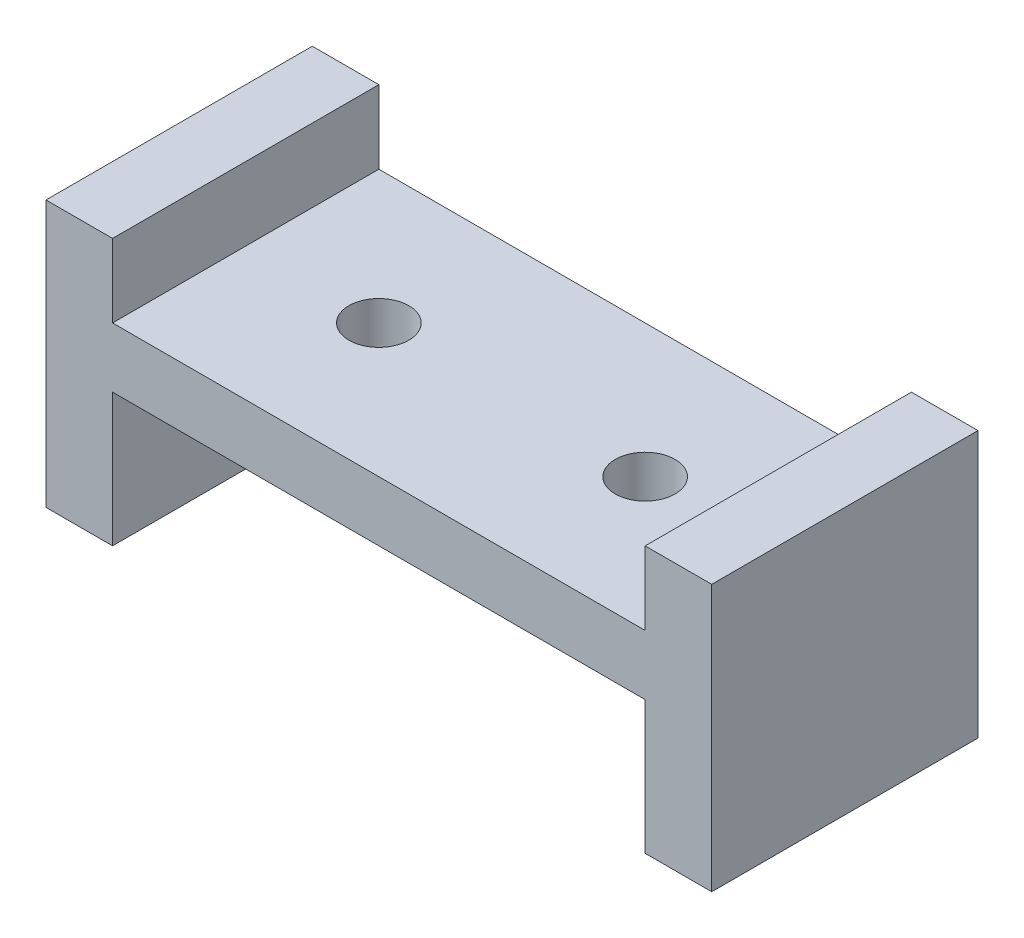
ISO-10303-21;
HEADER;
FILE_DESCRIPTION(('STEP AP214'),'2;1');
FILE_NAME('part.step','',(''),(''),'','','');
FILE_SCHEMA(('AUTOMOTIVE_DESIGN { 1 0 10303 214 1 1 1 1 }'));
ENDSEC;
DATA;
#1=APPLICATION_CONTEXT('core data for automotive mechanical design processes');
#2=APPLICATION_PROTOCOL_DEFINITION('international standard','automotive_design',2000,#1);
#3=PRODUCT_CONTEXT('',#1,'mechanical');
#4=PRODUCT('Part','Part','',(#3));
#5=PRODUCT_RELATED_PRODUCT_CATEGORY('part','',(#4));
#6=PRODUCT_DEFINITION_FORMATION('','',#4);
#7=PRODUCT_DEFINITION_CONTEXT('part definition',#1,'design');
#8=PRODUCT_DEFINITION('design','',#6,#7);
#9=PRODUCT_DEFINITION_SHAPE('','',#8);
#10=(LENGTH_UNIT() NAMED_UNIT(*) SI_UNIT(.MILLI.,.METRE.));
#11=(NAMED_UNIT(*) PLANE_ANGLE_UNIT() SI_UNIT($,.RADIAN.));
#12=(NAMED_UNIT(*) SI_UNIT($,.STERADIAN.) SOLID_ANGLE_UNIT());
#13=UNCERTAINTY_MEASURE_WITH_UNIT(LENGTH_MEASURE(1.E-05),#10,'distance_accuracy_value','');
#14=(GEOMETRIC_REPRESENTATION_CONTEXT(3) GLOBAL_UNCERTAINTY_ASSIGNED_CONTEXT((#13)) GLOBAL_UNIT_ASSIGNED_CONTEXT((#10,
#11,#12)) REPRESENTATION_CONTEXT('',''));
#15=CARTESIAN_POINT('',(0.,0.,0.));
#16=DIRECTION('',(0.,0.,1.));
#17=DIRECTION('',(1.,0.,0.));
#18=AXIS2_PLACEMENT_3D('',#15,#16,#17);
#19=CARTESIAN_POINT('',(0.,4.5,0.));
#20=DIRECTION('',(0.,1.,0.));
#21=DIRECTION('',(0.,0.,1.));
#22=AXIS2_PLACEMENT_3D('',#19,#20,#21);
#23=PLANE('',#22);
#24=CARTESIAN_POINT('',(-30.,4.5,185.));
#25=DIRECTION('',(0.,1.,0.));
#26=DIRECTION('',(0.,0.,1.));
#27=AXIS2_PLACEMENT_3D('',#24,#25,#26);
#28=CIRCLE('',#27,2.25);
#29=CARTESIAN_POINT('',(-30.,4.5,187.25));
#30=VERTEX_POINT('',#29);
#31=EDGE_CURVE('E213',#30,#30,#28,.T.);
#32=ORIENTED_EDGE('',*,*,#31,.F.);
#33=EDGE_LOOP('',(#32));
#34=FACE_BOUND('',#33,.T.);
#35=CARTESIAN_POINT('',(-9.99999999999998,4.5,185.));
#36=DIRECTION('',(0.,1.,0.));
#37=DIRECTION('',(0.,0.,1.));
#38=AXIS2_PLACEMENT_3D('',#35,#36,#37);
#39=CIRCLE('',#38,2.25);
#40=CARTESIAN_POINT('',(-9.99999999999998,4.5,187.25));
#41=VERTEX_POINT('',#40);
#42=EDGE_CURVE('E207',#41,#41,#39,.T.);
#43=ORIENTED_EDGE('',*,*,#42,.F.);
#44=EDGE_LOOP('',(#43));
#45=FACE_BOUND('',#44,.T.);
#46=DIRECTION('',(-1.,0.,0.));
#47=VECTOR('',#46,1.);
#48=CARTESIAN_POINT('',(5.00000000000004,4.5,175.));
#49=LINE('',#48,#47);
#50=CARTESIAN_POINT('',(0.,4.5,175.));
#51=VERTEX_POINT('',#50);
#52=CARTESIAN_POINT('',(-40.,4.5,175.));
#53=VERTEX_POINT('',#52);
#54=EDGE_CURVE('E220',#51,#53,#49,.T.);
#55=ORIENTED_EDGE('',*,*,#54,.T.);
#56=DIRECTION('',(0.,0.,-1.));
#57=VECTOR('',#56,1.);
#58=CARTESIAN_POINT('',(-40.,4.5,175.));
#59=LINE('',#58,#57);
#60=CARTESIAN_POINT('',(-40.,4.5,195.));
#61=VERTEX_POINT('',#60);
#62=EDGE_CURVE('E57',#61,#53,#59,.T.);
#63=ORIENTED_EDGE('',*,*,#62,.F.);
#64=DIRECTION('',(1.,0.,0.));
#65=VECTOR('',#64,1.);
#66=CARTESIAN_POINT('',(-45.,4.5,195.));
#67=LINE('',#66,#65);
#68=CARTESIAN_POINT('',(0.,4.5,195.));
#69=VERTEX_POINT('',#68);
#70=EDGE_CURVE('E218',#61,#69,#67,.T.);
#71=ORIENTED_EDGE('',*,*,#70,.T.);
#72=DIRECTION('',(0.,0.,1.));
#73=VECTOR('',#72,1.);
#74=CARTESIAN_POINT('',(0.,4.5,175.));
#75=LINE('',#74,#73);
#76=EDGE_CURVE('E187',#51,#69,#75,.T.);
#77=ORIENTED_EDGE('',*,*,#76,.F.);
#78=EDGE_LOOP('',(#55,#63,#71,#77));
#79=FACE_BOUND('',#78,.T.);
#80=ADVANCED_FACE('F34',(#34,#45,#79),#23,.T.);
#81=CARTESIAN_POINT('',(0.,0.,0.));
#82=DIRECTION('',(0.,1.,0.));
#83=DIRECTION('',(0.,0.,1.));
#84=AXIS2_PLACEMENT_3D('',#81,#82,#83);
#85=PLANE('',#84);
#86=DIRECTION('',(1.,0.,0.));
#87=VECTOR('',#86,1.);
#88=CARTESIAN_POINT('',(-4.99999999999996,0.,195.));
#89=LINE('',#88,#87);
#90=CARTESIAN_POINT('',(-40.,0.,195.));
#91=VERTEX_POINT('',#90);
#92=CARTESIAN_POINT('',(0.,0.,195.));
#93=VERTEX_POINT('',#92);
#94=EDGE_CURVE('E49',#91,#93,#89,.T.);
#95=ORIENTED_EDGE('',*,*,#94,.F.);
#96=DIRECTION('',(0.,0.,-1.));
#97=VECTOR('',#96,1.);
#98=CARTESIAN_POINT('',(-40.,0.,0.));
#99=LINE('',#98,#97);
#100=CARTESIAN_POINT('',(-40.,0.,175.));
#101=VERTEX_POINT('',#100);
#102=EDGE_CURVE('E129',#91,#101,#99,.T.);
#103=ORIENTED_EDGE('',*,*,#102,.T.);
#104=DIRECTION('',(-1.,0.,0.));
#105=VECTOR('',#104,1.);
#106=CARTESIAN_POINT('',(-35.,0.,175.));
#107=LINE('',#106,#105);
#108=CARTESIAN_POINT('',(0.,0.,175.));
#109=VERTEX_POINT('',#108);
#110=EDGE_CURVE('E221',#109,#101,#107,.T.);
#111=ORIENTED_EDGE('',*,*,#110,.F.);
#112=DIRECTION('',(0.,0.,1.));
#113=VECTOR('',#112,1.);
#114=CARTESIAN_POINT('',(0.,0.,0.));
#115=LINE('',#114,#113);
#116=EDGE_CURVE('E130',#109,#93,#115,.T.);
#117=ORIENTED_EDGE('',*,*,#116,.T.);
#118=EDGE_LOOP('',(#95,#103,#111,#117));
#119=FACE_BOUND('',#118,.T.);
#120=CARTESIAN_POINT('',(-30.,0.,185.));
#121=DIRECTION('',(0.,1.,0.));
#122=DIRECTION('',(0.,0.,1.));
#123=AXIS2_PLACEMENT_3D('',#120,#121,#122);
#124=CIRCLE('',#123,2.25);
#125=CARTESIAN_POINT('',(-30.,0.,187.25));
#126=VERTEX_POINT('',#125);
#127=EDGE_CURVE('E210',#126,#126,#124,.T.);
#128=ORIENTED_EDGE('',*,*,#127,.T.);
#129=EDGE_LOOP('',(#128));
#130=FACE_BOUND('',#129,.T.);
#131=CARTESIAN_POINT('',(-9.99999999999998,0.,185.));
#132=DIRECTION('',(0.,1.,0.));
#133=DIRECTION('',(0.,0.,1.));
#134=AXIS2_PLACEMENT_3D('',#131,#132,#133);
#135=CIRCLE('',#134,2.25);
#136=CARTESIAN_POINT('',(-9.99999999999998,0.,187.25));
#137=VERTEX_POINT('',#136);
#138=EDGE_CURVE('E206',#137,#137,#135,.T.);
#139=ORIENTED_EDGE('',*,*,#138,.T.);
#140=EDGE_LOOP('',(#139));
#141=FACE_BOUND('',#140,.T.);
#142=ADVANCED_FACE('F264',(#119,#130,#141),#85,.F.);
#143=CARTESIAN_POINT('',(-45.,4.5,175.));
#144=DIRECTION('',(1.,0.,0.));
#145=DIRECTION('',(0.,0.,-1.));
#146=AXIS2_PLACEMENT_3D('',#143,#144,#145);
#147=PLANE('',#146);
#148=DIRECTION('',(0.,-1.,0.));
#149=VECTOR('',#148,1.);
#150=CARTESIAN_POINT('',(-45.,4.5,175.));
#151=LINE('',#150,#149);
#152=CARTESIAN_POINT('',(-45.,10.,175.));
#153=VERTEX_POINT('',#152);
#154=CARTESIAN_POINT('',(-45.,-10.,175.));
#155=VERTEX_POINT('',#154);
#156=EDGE_CURVE('E223',#153,#155,#151,.T.);
#157=ORIENTED_EDGE('',*,*,#156,.T.);
#158=DIRECTION('',(0.,0.,-1.));
#159=VECTOR('',#158,1.);
#160=CARTESIAN_POINT('',(-45.,-10.,0.));
#161=LINE('',#160,#159);
#162=CARTESIAN_POINT('',(-45.,-10.,195.));
#163=VERTEX_POINT('',#162);
#164=EDGE_CURVE('E140',#163,#155,#161,.T.);
#165=ORIENTED_EDGE('',*,*,#164,.F.);
#166=DIRECTION('',(0.,-1.,0.));
#167=VECTOR('',#166,1.);
#168=CARTESIAN_POINT('',(-45.,4.5,195.));
#169=LINE('',#168,#167);
#170=CARTESIAN_POINT('',(-45.,10.,195.));
#171=VERTEX_POINT('',#170);
#172=EDGE_CURVE('E11',#171,#163,#169,.T.);
#173=ORIENTED_EDGE('',*,*,#172,.F.);
#174=DIRECTION('',(0.,0.,1.));
#175=VECTOR('',#174,1.);
#176=CARTESIAN_POINT('',(-45.,10.,195.));
#177=LINE('',#176,#175);
#178=EDGE_CURVE('E177',#153,#171,#177,.T.);
#179=ORIENTED_EDGE('',*,*,#178,.F.);
#180=EDGE_LOOP('',(#157,#165,#173,#179));
#181=FACE_BOUND('',#180,.T.);
#182=ADVANCED_FACE('F36',(#181),#147,.F.);
#183=CARTESIAN_POINT('',(-4.99999999999996,4.5,195.));
#184=DIRECTION('',(0.,0.,-1.));
#185=DIRECTION('',(-1.,0.,0.));
#186=AXIS2_PLACEMENT_3D('',#183,#184,#185);
#187=PLANE('',#186);
#188=ORIENTED_EDGE('',*,*,#172,.T.);
#189=DIRECTION('',(-1.,0.,0.));
#190=VECTOR('',#189,1.);
#191=CARTESIAN_POINT('',(0.,-10.,195.));
#192=LINE('',#191,#190);
#193=CARTESIAN_POINT('',(-40.,-10.,195.));
#194=VERTEX_POINT('',#193);
#195=EDGE_CURVE('E134',#194,#163,#192,.T.);
#196=ORIENTED_EDGE('',*,*,#195,.F.);
#197=DIRECTION('',(0.,1.,0.));
#198=VECTOR('',#197,1.);
#199=CARTESIAN_POINT('',(-40.,-10.,195.));
#200=LINE('',#199,#198);
#201=EDGE_CURVE('E123',#194,#91,#200,.T.);
#202=ORIENTED_EDGE('',*,*,#201,.T.);
#203=ORIENTED_EDGE('',*,*,#94,.T.);
#204=DIRECTION('',(0.,1.,0.));
#205=VECTOR('',#204,1.);
#206=CARTESIAN_POINT('',(0.,-10.,195.));
#207=LINE('',#206,#205);
#208=CARTESIAN_POINT('',(0.,-10.,195.));
#209=VERTEX_POINT('',#208);
#210=EDGE_CURVE('E163',#209,#93,#207,.T.);
#211=ORIENTED_EDGE('',*,*,#210,.F.);
#212=DIRECTION('',(-1.,0.,0.));
#213=VECTOR('',#212,1.);
#214=CARTESIAN_POINT('',(0.,-10.,195.));
#215=LINE('',#214,#213);
#216=CARTESIAN_POINT('',(5.00000000000004,-10.,195.));
#217=VERTEX_POINT('',#216);
#218=EDGE_CURVE('E161',#217,#209,#215,.T.);
#219=ORIENTED_EDGE('',*,*,#218,.F.);
#220=DIRECTION('',(0.,-1.,0.));
#221=VECTOR('',#220,1.);
#222=CARTESIAN_POINT('',(5.00000000000004,4.5,195.));
#223=LINE('',#222,#221);
#224=CARTESIAN_POINT('',(5.00000000000004,10.,195.));
#225=VERTEX_POINT('',#224);
#226=EDGE_CURVE('E42',#225,#217,#223,.T.);
#227=ORIENTED_EDGE('',*,*,#226,.F.);
#228=DIRECTION('',(1.,0.,0.));
#229=VECTOR('',#228,1.);
#230=CARTESIAN_POINT('',(0.,10.,195.));
#231=LINE('',#230,#229);
#232=CARTESIAN_POINT('',(0.,10.,195.));
#233=VERTEX_POINT('',#232);
#234=EDGE_CURVE('E188',#233,#225,#231,.T.);
#235=ORIENTED_EDGE('',*,*,#234,.F.);
#236=DIRECTION('',(0.,-1.,0.));
#237=VECTOR('',#236,1.);
#238=CARTESIAN_POINT('',(0.,10.,195.));
#239=LINE('',#238,#237);
#240=EDGE_CURVE('E198',#233,#69,#239,.T.);
#241=ORIENTED_EDGE('',*,*,#240,.T.);
#242=ORIENTED_EDGE('',*,*,#70,.F.);
#243=DIRECTION('',(0.,-1.,0.));
#244=VECTOR('',#243,1.);
#245=CARTESIAN_POINT('',(-40.,10.,195.));
#246=LINE('',#245,#244);
#247=CARTESIAN_POINT('',(-40.,10.,195.));
#248=VERTEX_POINT('',#247);
#249=EDGE_CURVE('E184',#248,#61,#246,.T.);
#250=ORIENTED_EDGE('',*,*,#249,.F.);
#251=DIRECTION('',(1.,0.,0.));
#252=VECTOR('',#251,1.);
#253=CARTESIAN_POINT('',(-40.,10.,195.));
#254=LINE('',#253,#252);
#255=EDGE_CURVE('E169',#171,#248,#254,.T.);
#256=ORIENTED_EDGE('',*,*,#255,.F.);
#257=EDGE_LOOP('',(#188,#196,#202,#203,#211,#219,#227,#235,#241,#242,#250,#256));
#258=FACE_BOUND('',#257,.T.);
#259=ADVANCED_FACE('F135',(#258),#187,.F.);
#260=CARTESIAN_POINT('',(5.00000000000004,4.5,195.));
#261=DIRECTION('',(-1.,0.,0.));
#262=DIRECTION('',(0.,0.,1.));
#263=AXIS2_PLACEMENT_3D('',#260,#261,#262);
#264=PLANE('',#263);
#265=ORIENTED_EDGE('',*,*,#226,.T.);
#266=DIRECTION('',(0.,0.,1.));
#267=VECTOR('',#266,1.);
#268=CARTESIAN_POINT('',(5.00000000000004,-10.,0.));
#269=LINE('',#268,#267);
#270=CARTESIAN_POINT('',(5.00000000000004,-10.,175.));
#271=VERTEX_POINT('',#270);
#272=EDGE_CURVE('E158',#271,#217,#269,.T.);
#273=ORIENTED_EDGE('',*,*,#272,.F.);
#274=DIRECTION('',(0.,-1.,0.));
#275=VECTOR('',#274,1.);
#276=CARTESIAN_POINT('',(5.00000000000004,4.5,175.));
#277=LINE('',#276,#275);
#278=CARTESIAN_POINT('',(5.00000000000004,10.,175.));
#279=VERTEX_POINT('',#278);
#280=EDGE_CURVE('E228',#279,#271,#277,.T.);
#281=ORIENTED_EDGE('',*,*,#280,.F.);
#282=DIRECTION('',(0.,0.,-1.));
#283=VECTOR('',#282,1.);
#284=CARTESIAN_POINT('',(5.00000000000004,10.,195.));
#285=LINE('',#284,#283);
#286=EDGE_CURVE('E191',#225,#279,#285,.T.);
#287=ORIENTED_EDGE('',*,*,#286,.F.);
#288=EDGE_LOOP('',(#265,#273,#281,#287));
#289=FACE_BOUND('',#288,.T.);
#290=ADVANCED_FACE('F232',(#289),#264,.F.);
#291=CARTESIAN_POINT('',(-35.,4.5,175.));
#292=DIRECTION('',(0.,0.,1.));
#293=DIRECTION('',(1.,0.,0.));
#294=AXIS2_PLACEMENT_3D('',#291,#292,#293);
#295=PLANE('',#294);
#296=ORIENTED_EDGE('',*,*,#280,.T.);
#297=DIRECTION('',(1.,0.,0.));
#298=VECTOR('',#297,1.);
#299=CARTESIAN_POINT('',(0.,-10.,175.));
#300=LINE('',#299,#298);
#301=CARTESIAN_POINT('',(0.,-10.,175.));
#302=VERTEX_POINT('',#301);
#303=EDGE_CURVE('E155',#302,#271,#300,.T.);
#304=ORIENTED_EDGE('',*,*,#303,.F.);
#305=DIRECTION('',(0.,1.,0.));
#306=VECTOR('',#305,1.);
#307=CARTESIAN_POINT('',(0.,-10.,175.));
#308=LINE('',#307,#306);
#309=EDGE_CURVE('E167',#302,#109,#308,.T.);
#310=ORIENTED_EDGE('',*,*,#309,.T.);
#311=ORIENTED_EDGE('',*,*,#110,.T.);
#312=DIRECTION('',(0.,1.,0.));
#313=VECTOR('',#312,1.);
#314=CARTESIAN_POINT('',(-40.,-10.,175.));
#315=LINE('',#314,#313);
#316=CARTESIAN_POINT('',(-40.,-10.,175.));
#317=VERTEX_POINT('',#316);
#318=EDGE_CURVE('E131',#317,#101,#315,.T.);
#319=ORIENTED_EDGE('',*,*,#318,.F.);
#320=DIRECTION('',(1.,0.,0.));
#321=VECTOR('',#320,1.);
#322=CARTESIAN_POINT('',(0.,-10.,175.));
#323=LINE('',#322,#321);
#324=EDGE_CURVE('E144',#155,#317,#323,.T.);
#325=ORIENTED_EDGE('',*,*,#324,.F.);
#326=ORIENTED_EDGE('',*,*,#156,.F.);
#327=DIRECTION('',(-1.,0.,0.));
#328=VECTOR('',#327,1.);
#329=CARTESIAN_POINT('',(-45.,10.,175.));
#330=LINE('',#329,#328);
#331=CARTESIAN_POINT('',(-40.,10.,175.));
#332=VERTEX_POINT('',#331);
#333=EDGE_CURVE('E174',#332,#153,#330,.T.);
#334=ORIENTED_EDGE('',*,*,#333,.F.);
#335=DIRECTION('',(0.,-1.,0.));
#336=VECTOR('',#335,1.);
#337=CARTESIAN_POINT('',(-40.,10.,175.));
#338=LINE('',#337,#336);
#339=EDGE_CURVE('E180',#332,#53,#338,.T.);
#340=ORIENTED_EDGE('',*,*,#339,.T.);
#341=ORIENTED_EDGE('',*,*,#54,.F.);
#342=DIRECTION('',(0.,-1.,0.));
#343=VECTOR('',#342,1.);
#344=CARTESIAN_POINT('',(0.,10.,175.));
#345=LINE('',#344,#343);
#346=CARTESIAN_POINT('',(0.,10.,175.));
#347=VERTEX_POINT('',#346);
#348=EDGE_CURVE('E203',#347,#51,#345,.T.);
#349=ORIENTED_EDGE('',*,*,#348,.F.);
#350=DIRECTION('',(-1.,0.,0.));
#351=VECTOR('',#350,1.);
#352=CARTESIAN_POINT('',(5.00000000000004,10.,175.));
#353=LINE('',#352,#351);
#354=EDGE_CURVE('E194',#279,#347,#353,.T.);
#355=ORIENTED_EDGE('',*,*,#354,.F.);
#356=EDGE_LOOP('',(#296,#304,#310,#311,#319,#325,#326,#334,#340,#341,#349,#355));
#357=FACE_BOUND('',#356,.T.);
#358=ADVANCED_FACE('F244',(#357),#295,.F.);
#359=CARTESIAN_POINT('',(-30.,4.5,185.));
#360=DIRECTION('',(0.,-1.,0.));
#361=DIRECTION('',(0.,0.,-1.));
#362=AXIS2_PLACEMENT_3D('',#359,#360,#361);
#363=CYLINDRICAL_SURFACE('',#362,2.25);
#364=ORIENTED_EDGE('',*,*,#31,.T.);
#365=EDGE_LOOP('',(#364));
#366=FACE_BOUND('',#365,.T.);
#367=ORIENTED_EDGE('',*,*,#127,.F.);
#368=EDGE_LOOP('',(#367));
#369=FACE_BOUND('',#368,.T.);
#370=ADVANCED_FACE('F274',(#366,#369),#363,.F.);
#371=CARTESIAN_POINT('',(-9.99999999999998,4.5,185.));
#372=DIRECTION('',(0.,-1.,0.));
#373=DIRECTION('',(0.,0.,-1.));
#374=AXIS2_PLACEMENT_3D('',#371,#372,#373);
#375=CYLINDRICAL_SURFACE('',#374,2.25);
#376=ORIENTED_EDGE('',*,*,#42,.T.);
#377=EDGE_LOOP('',(#376));
#378=FACE_BOUND('',#377,.T.);
#379=ORIENTED_EDGE('',*,*,#138,.F.);
#380=EDGE_LOOP('',(#379));
#381=FACE_BOUND('',#380,.T.);
#382=ADVANCED_FACE('F272',(#378,#381),#375,.F.);
#383=CARTESIAN_POINT('',(0.,10.,175.));
#384=DIRECTION('',(1.,0.,0.));
#385=DIRECTION('',(0.,0.,-1.));
#386=AXIS2_PLACEMENT_3D('',#383,#384,#385);
#387=PLANE('',#386);
#388=ORIENTED_EDGE('',*,*,#76,.T.);
#389=ORIENTED_EDGE('',*,*,#240,.F.);
#390=DIRECTION('',(0.,0.,1.));
#391=VECTOR('',#390,1.);
#392=CARTESIAN_POINT('',(0.,10.,175.));
#393=LINE('',#392,#391);
#394=EDGE_CURVE('E196',#347,#233,#393,.T.);
#395=ORIENTED_EDGE('',*,*,#394,.F.);
#396=ORIENTED_EDGE('',*,*,#348,.T.);
#397=EDGE_LOOP('',(#388,#389,#395,#396));
#398=FACE_BOUND('',#397,.T.);
#399=ADVANCED_FACE('F253',(#398),#387,.F.);
#400=CARTESIAN_POINT('',(0.,10.,0.));
#401=DIRECTION('',(0.,1.,0.));
#402=DIRECTION('',(0.,0.,1.));
#403=AXIS2_PLACEMENT_3D('',#400,#401,#402);
#404=PLANE('',#403);
#405=ORIENTED_EDGE('',*,*,#234,.T.);
#406=ORIENTED_EDGE('',*,*,#286,.T.);
#407=ORIENTED_EDGE('',*,*,#354,.T.);
#408=ORIENTED_EDGE('',*,*,#394,.T.);
#409=EDGE_LOOP('',(#405,#406,#407,#408));
#410=FACE_BOUND('',#409,.T.);
#411=ADVANCED_FACE('F248',(#410),#404,.T.);
#412=CARTESIAN_POINT('',(-40.,10.,175.));
#413=DIRECTION('',(-1.,0.,0.));
#414=DIRECTION('',(0.,0.,1.));
#415=AXIS2_PLACEMENT_3D('',#412,#413,#414);
#416=PLANE('',#415);
#417=ORIENTED_EDGE('',*,*,#62,.T.);
#418=ORIENTED_EDGE('',*,*,#339,.F.);
#419=DIRECTION('',(0.,0.,-1.));
#420=VECTOR('',#419,1.);
#421=CARTESIAN_POINT('',(-40.,10.,175.));
#422=LINE('',#421,#420);
#423=EDGE_CURVE('E172',#248,#332,#422,.T.);
#424=ORIENTED_EDGE('',*,*,#423,.F.);
#425=ORIENTED_EDGE('',*,*,#249,.T.);
#426=EDGE_LOOP('',(#417,#418,#424,#425));
#427=FACE_BOUND('',#426,.T.);
#428=ADVANCED_FACE('F258',(#427),#416,.F.);
#429=CARTESIAN_POINT('',(0.,10.,0.));
#430=DIRECTION('',(0.,-1.,0.));
#431=DIRECTION('',(0.,0.,-1.));
#432=AXIS2_PLACEMENT_3D('',#429,#430,#431);
#433=PLANE('',#432);
#434=ORIENTED_EDGE('',*,*,#255,.T.);
#435=ORIENTED_EDGE('',*,*,#423,.T.);
#436=ORIENTED_EDGE('',*,*,#333,.T.);
#437=ORIENTED_EDGE('',*,*,#178,.T.);
#438=EDGE_LOOP('',(#434,#435,#436,#437));
#439=FACE_BOUND('',#438,.T.);
#440=ADVANCED_FACE('F260',(#439),#433,.F.);
#441=CARTESIAN_POINT('',(0.,-10.,0.));
#442=DIRECTION('',(-1.,0.,0.));
#443=DIRECTION('',(0.,0.,1.));
#444=AXIS2_PLACEMENT_3D('',#441,#442,#443);
#445=PLANE('',#444);
#446=ORIENTED_EDGE('',*,*,#116,.F.);
#447=ORIENTED_EDGE('',*,*,#309,.F.);
#448=DIRECTION('',(0.,0.,1.));
#449=VECTOR('',#448,1.);
#450=CARTESIAN_POINT('',(0.,-10.,0.));
#451=LINE('',#450,#449);
#452=EDGE_CURVE('E152',#302,#209,#451,.T.);
#453=ORIENTED_EDGE('',*,*,#452,.T.);
#454=ORIENTED_EDGE('',*,*,#210,.T.);
#455=EDGE_LOOP('',(#446,#447,#453,#454));
#456=FACE_BOUND('',#455,.T.);
#457=ADVANCED_FACE('F241',(#456),#445,.T.);
#458=CARTESIAN_POINT('',(0.,-10.,0.));
#459=DIRECTION('',(0.,-1.,0.));
#460=DIRECTION('',(0.,0.,-1.));
#461=AXIS2_PLACEMENT_3D('',#458,#459,#460);
#462=PLANE('',#461);
#463=ORIENTED_EDGE('',*,*,#452,.F.);
#464=ORIENTED_EDGE('',*,*,#303,.T.);
#465=ORIENTED_EDGE('',*,*,#272,.T.);
#466=ORIENTED_EDGE('',*,*,#218,.T.);
#467=EDGE_LOOP('',(#463,#464,#465,#466));
#468=FACE_BOUND('',#467,.T.);
#469=ADVANCED_FACE('F237',(#468),#462,.T.);
#470=CARTESIAN_POINT('',(-40.,-10.,0.));
#471=DIRECTION('',(1.,0.,0.));
#472=DIRECTION('',(0.,0.,-1.));
#473=AXIS2_PLACEMENT_3D('',#470,#471,#472);
#474=PLANE('',#473);
#475=ORIENTED_EDGE('',*,*,#102,.F.);
#476=ORIENTED_EDGE('',*,*,#201,.F.);
#477=DIRECTION('',(0.,0.,-1.));
#478=VECTOR('',#477,1.);
#479=CARTESIAN_POINT('',(-40.,-10.,0.));
#480=LINE('',#479,#478);
#481=EDGE_CURVE('E127',#194,#317,#480,.T.);
#482=ORIENTED_EDGE('',*,*,#481,.T.);
#483=ORIENTED_EDGE('',*,*,#318,.T.);
#484=EDGE_LOOP('',(#475,#476,#482,#483));
#485=FACE_BOUND('',#484,.T.);
#486=ADVANCED_FACE('F125',(#485),#474,.T.);
#487=CARTESIAN_POINT('',(0.,-10.,0.));
#488=DIRECTION('',(0.,-1.,0.));
#489=DIRECTION('',(0.,0.,-1.));
#490=AXIS2_PLACEMENT_3D('',#487,#488,#489);
#491=PLANE('',#490);
#492=ORIENTED_EDGE('',*,*,#481,.F.);
#493=ORIENTED_EDGE('',*,*,#195,.T.);
#494=ORIENTED_EDGE('',*,*,#164,.T.);
#495=ORIENTED_EDGE('',*,*,#324,.T.);
#496=EDGE_LOOP('',(#492,#493,#494,#495));
#497=FACE_BOUND('',#496,.T.);
#498=ADVANCED_FACE('F142',(#497),#491,.T.);
#499=CLOSED_SHELL('',(#80,#142,#182,#259,#290,#358,#370,#382,#399,#411,#428,#440,#457,#469,#486,#498));
#500=MANIFOLD_SOLID_BREP('B2',#499);
#501=ADVANCED_BREP_SHAPE_REPRESENTATION('',(#18,#500),#14);
#502=SHAPE_DEFINITION_REPRESENTATION(#9,#501);
ENDSEC;
END-ISO-10303-21;
